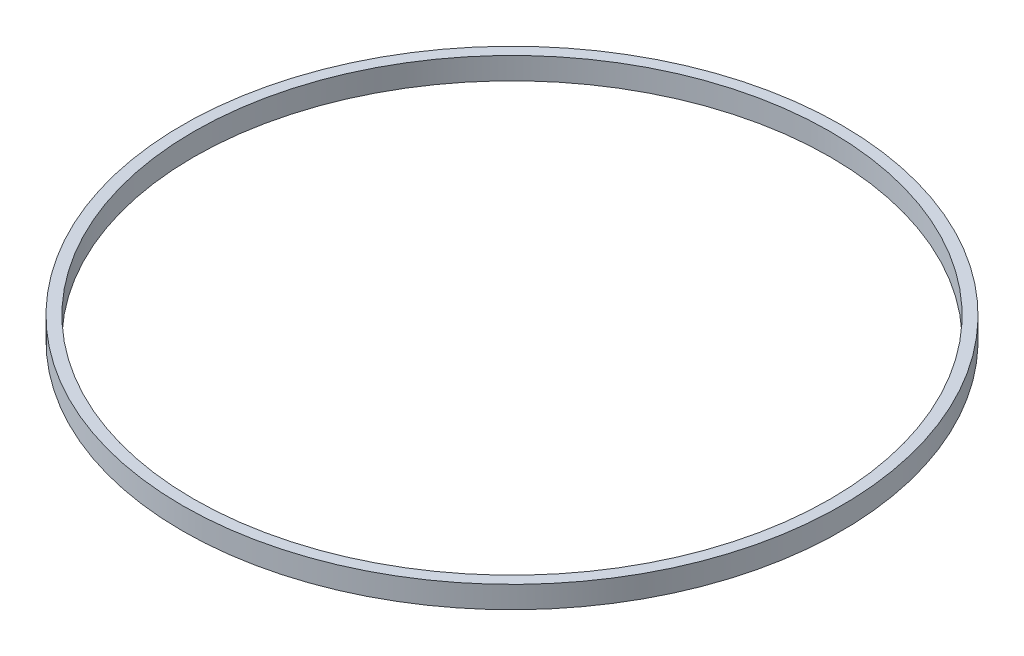
ISO-10303-21;
HEADER;
FILE_DESCRIPTION(('STEP AP214'),'2;1');
FILE_NAME('part.step','',(''),(''),'','','');
FILE_SCHEMA(('AUTOMOTIVE_DESIGN { 1 0 10303 214 1 1 1 1 }'));
ENDSEC;
DATA;
#1=APPLICATION_CONTEXT('core data for automotive mechanical design processes');
#2=APPLICATION_PROTOCOL_DEFINITION('international standard','automotive_design',2000,#1);
#3=PRODUCT_CONTEXT('',#1,'mechanical');
#4=PRODUCT('Part','Part','',(#3));
#5=PRODUCT_RELATED_PRODUCT_CATEGORY('part','',(#4));
#6=PRODUCT_DEFINITION_FORMATION('','',#4);
#7=PRODUCT_DEFINITION_CONTEXT('part definition',#1,'design');
#8=PRODUCT_DEFINITION('design','',#6,#7);
#9=PRODUCT_DEFINITION_SHAPE('','',#8);
#10=(LENGTH_UNIT() NAMED_UNIT(*) SI_UNIT(.MILLI.,.METRE.));
#11=(NAMED_UNIT(*) PLANE_ANGLE_UNIT() SI_UNIT($,.RADIAN.));
#12=(NAMED_UNIT(*) SI_UNIT($,.STERADIAN.) SOLID_ANGLE_UNIT());
#13=UNCERTAINTY_MEASURE_WITH_UNIT(LENGTH_MEASURE(1.E-05),#10,'distance_accuracy_value','');
#14=(GEOMETRIC_REPRESENTATION_CONTEXT(3) GLOBAL_UNCERTAINTY_ASSIGNED_CONTEXT((#13)) GLOBAL_UNIT_ASSIGNED_CONTEXT((#10,
#11,#12)) REPRESENTATION_CONTEXT('',''));
#15=CARTESIAN_POINT('',(0.,0.,0.));
#16=DIRECTION('',(0.,0.,1.));
#17=DIRECTION('',(1.,0.,0.));
#18=AXIS2_PLACEMENT_3D('',#15,#16,#17);
#19=CARTESIAN_POINT('',(0.,100.,0.));
#20=DIRECTION('',(0.,1.,0.));
#21=DIRECTION('',(0.,0.,1.));
#22=AXIS2_PLACEMENT_3D('',#19,#20,#21);
#23=PLANE('',#22);
#24=CARTESIAN_POINT('',(0.,100.,0.));
#25=DIRECTION('',(0.,1.,0.));
#26=DIRECTION('',(0.,0.,1.));
#27=AXIS2_PLACEMENT_3D('',#24,#25,#26);
#28=CIRCLE('',#27,1500.);
#29=CARTESIAN_POINT('',(0.,100.,1500.));
#30=VERTEX_POINT('',#29);
#31=EDGE_CURVE('E10',#30,#30,#28,.T.);
#32=ORIENTED_EDGE('',*,*,#31,.T.);
#33=EDGE_LOOP('',(#32));
#34=FACE_BOUND('',#33,.T.);
#35=CARTESIAN_POINT('',(0.,100.,0.));
#36=DIRECTION('',(0.,1.,0.));
#37=DIRECTION('',(0.,0.,1.));
#38=AXIS2_PLACEMENT_3D('',#35,#36,#37);
#39=CIRCLE('',#38,1448.6474252953);
#40=CARTESIAN_POINT('',(0.,100.,1448.6474252953));
#41=VERTEX_POINT('',#40);
#42=EDGE_CURVE('E42',#41,#41,#39,.T.);
#43=ORIENTED_EDGE('',*,*,#42,.F.);
#44=EDGE_LOOP('',(#43));
#45=FACE_BOUND('',#44,.T.);
#46=ADVANCED_FACE('F31',(#34,#45),#23,.T.);
#47=CARTESIAN_POINT('',(0.,0.,0.));
#48=DIRECTION('',(0.,1.,0.));
#49=DIRECTION('',(0.,0.,1.));
#50=AXIS2_PLACEMENT_3D('',#47,#48,#49);
#51=PLANE('',#50);
#52=CARTESIAN_POINT('',(0.,0.,0.));
#53=DIRECTION('',(0.,1.,0.));
#54=DIRECTION('',(0.,0.,1.));
#55=AXIS2_PLACEMENT_3D('',#52,#53,#54);
#56=CIRCLE('',#55,1500.);
#57=CARTESIAN_POINT('',(0.,0.,1500.));
#58=VERTEX_POINT('',#57);
#59=EDGE_CURVE('E35',#58,#58,#56,.T.);
#60=ORIENTED_EDGE('',*,*,#59,.F.);
#61=EDGE_LOOP('',(#60));
#62=FACE_BOUND('',#61,.T.);
#63=CARTESIAN_POINT('',(0.,0.,0.));
#64=DIRECTION('',(0.,1.,0.));
#65=DIRECTION('',(0.,0.,1.));
#66=AXIS2_PLACEMENT_3D('',#63,#64,#65);
#67=CIRCLE('',#66,1448.6474252953);
#68=CARTESIAN_POINT('',(0.,0.,1448.6474252953));
#69=VERTEX_POINT('',#68);
#70=EDGE_CURVE('E44',#69,#69,#67,.T.);
#71=ORIENTED_EDGE('',*,*,#70,.T.);
#72=EDGE_LOOP('',(#71));
#73=FACE_BOUND('',#72,.T.);
#74=ADVANCED_FACE('F54',(#62,#73),#51,.F.);
#75=CARTESIAN_POINT('',(0.,100.,0.));
#76=DIRECTION('',(0.,-1.,0.));
#77=DIRECTION('',(0.,0.,-1.));
#78=AXIS2_PLACEMENT_3D('',#75,#76,#77);
#79=CYLINDRICAL_SURFACE('',#78,1500.);
#80=ORIENTED_EDGE('',*,*,#31,.F.);
#81=EDGE_LOOP('',(#80));
#82=FACE_BOUND('',#81,.T.);
#83=ORIENTED_EDGE('',*,*,#59,.T.);
#84=EDGE_LOOP('',(#83));
#85=FACE_BOUND('',#84,.T.);
#86=ADVANCED_FACE('F33',(#82,#85),#79,.T.);
#87=CARTESIAN_POINT('',(0.,100.,0.));
#88=DIRECTION('',(0.,-1.,0.));
#89=DIRECTION('',(0.,0.,-1.));
#90=AXIS2_PLACEMENT_3D('',#87,#88,#89);
#91=CYLINDRICAL_SURFACE('',#90,1448.6474252953);
#92=ORIENTED_EDGE('',*,*,#42,.T.);
#93=EDGE_LOOP('',(#92));
#94=FACE_BOUND('',#93,.T.);
#95=ORIENTED_EDGE('',*,*,#70,.F.);
#96=EDGE_LOOP('',(#95));
#97=FACE_BOUND('',#96,.T.);
#98=ADVANCED_FACE('F50',(#94,#97),#91,.F.);
#99=CLOSED_SHELL('',(#46,#74,#86,#98));
#100=MANIFOLD_SOLID_BREP('B2',#99);
#101=ADVANCED_BREP_SHAPE_REPRESENTATION('',(#18,#100),#14);
#102=SHAPE_DEFINITION_REPRESENTATION(#9,#101);
ENDSEC;
END-ISO-10303-21;
